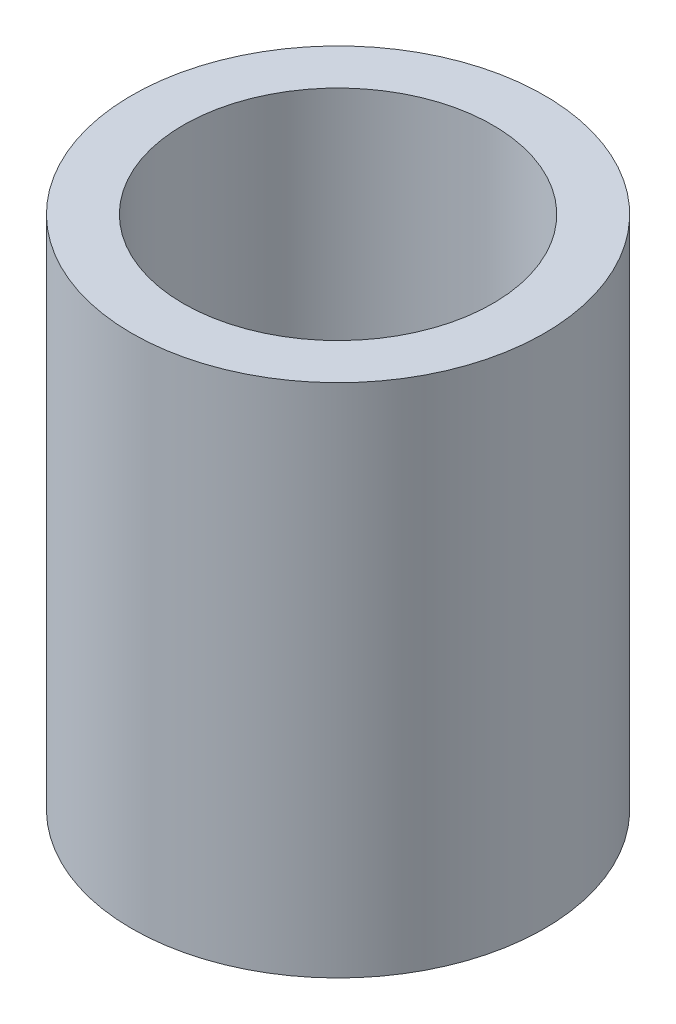
ISO-10303-21;
HEADER;
FILE_DESCRIPTION(('STEP AP214'),'2;1');
FILE_NAME('part.step','',(''),(''),'','','');
FILE_SCHEMA(('AUTOMOTIVE_DESIGN { 1 0 10303 214 1 1 1 1 }'));
ENDSEC;
DATA;
#1=APPLICATION_CONTEXT('core data for automotive mechanical design processes');
#2=APPLICATION_PROTOCOL_DEFINITION('international standard','automotive_design',2000,#1);
#3=PRODUCT_CONTEXT('',#1,'mechanical');
#4=PRODUCT('Part','Part','',(#3));
#5=PRODUCT_RELATED_PRODUCT_CATEGORY('part','',(#4));
#6=PRODUCT_DEFINITION_FORMATION('','',#4);
#7=PRODUCT_DEFINITION_CONTEXT('part definition',#1,'design');
#8=PRODUCT_DEFINITION('design','',#6,#7);
#9=PRODUCT_DEFINITION_SHAPE('','',#8);
#10=(LENGTH_UNIT() NAMED_UNIT(*) SI_UNIT(.MILLI.,.METRE.));
#11=(NAMED_UNIT(*) PLANE_ANGLE_UNIT() SI_UNIT($,.RADIAN.));
#12=(NAMED_UNIT(*) SI_UNIT($,.STERADIAN.) SOLID_ANGLE_UNIT());
#13=UNCERTAINTY_MEASURE_WITH_UNIT(LENGTH_MEASURE(1.E-05),#10,'distance_accuracy_value','');
#14=(GEOMETRIC_REPRESENTATION_CONTEXT(3) GLOBAL_UNCERTAINTY_ASSIGNED_CONTEXT((#13)) GLOBAL_UNIT_ASSIGNED_CONTEXT((#10,
#11,#12)) REPRESENTATION_CONTEXT('',''));
#15=CARTESIAN_POINT('',(0.,0.,0.));
#16=DIRECTION('',(0.,0.,1.));
#17=DIRECTION('',(1.,0.,0.));
#18=AXIS2_PLACEMENT_3D('',#15,#16,#17);
#19=CARTESIAN_POINT('',(0.,20.,0.));
#20=DIRECTION('',(0.,1.,0.));
#21=DIRECTION('',(0.,0.,1.));
#22=AXIS2_PLACEMENT_3D('',#19,#20,#21);
#23=PLANE('',#22);
#24=CARTESIAN_POINT('',(0.,20.,0.));
#25=DIRECTION('',(0.,1.,0.));
#26=DIRECTION('',(0.,0.,1.));
#27=AXIS2_PLACEMENT_3D('',#24,#25,#26);
#28=CIRCLE('',#27,16.);
#29=CARTESIAN_POINT('',(0.,20.,16.));
#30=VERTEX_POINT('',#29);
#31=EDGE_CURVE('E10',#30,#30,#28,.T.);
#32=ORIENTED_EDGE('',*,*,#31,.T.);
#33=EDGE_LOOP('',(#32));
#34=FACE_BOUND('',#33,.T.);
#35=CARTESIAN_POINT('',(0.,20.,0.));
#36=DIRECTION('',(0.,1.,0.));
#37=DIRECTION('',(0.,0.,1.));
#38=AXIS2_PLACEMENT_3D('',#35,#36,#37);
#39=CIRCLE('',#38,12.);
#40=CARTESIAN_POINT('',(0.,20.,12.));
#41=VERTEX_POINT('',#40);
#42=EDGE_CURVE('E41',#41,#41,#39,.T.);
#43=ORIENTED_EDGE('',*,*,#42,.F.);
#44=EDGE_LOOP('',(#43));
#45=FACE_BOUND('',#44,.T.);
#46=ADVANCED_FACE('F30',(#34,#45),#23,.T.);
#47=CARTESIAN_POINT('',(0.,-20.,0.));
#48=DIRECTION('',(0.,1.,0.));
#49=DIRECTION('',(0.,0.,1.));
#50=AXIS2_PLACEMENT_3D('',#47,#48,#49);
#51=PLANE('',#50);
#52=CARTESIAN_POINT('',(0.,-20.,0.));
#53=DIRECTION('',(0.,1.,0.));
#54=DIRECTION('',(0.,0.,1.));
#55=AXIS2_PLACEMENT_3D('',#52,#53,#54);
#56=CIRCLE('',#55,16.);
#57=CARTESIAN_POINT('',(0.,-20.,16.));
#58=VERTEX_POINT('',#57);
#59=EDGE_CURVE('E34',#58,#58,#56,.T.);
#60=ORIENTED_EDGE('',*,*,#59,.F.);
#61=EDGE_LOOP('',(#60));
#62=FACE_BOUND('',#61,.T.);
#63=CARTESIAN_POINT('',(0.,-20.,0.));
#64=DIRECTION('',(0.,1.,0.));
#65=DIRECTION('',(0.,0.,1.));
#66=AXIS2_PLACEMENT_3D('',#63,#64,#65);
#67=CIRCLE('',#66,12.);
#68=CARTESIAN_POINT('',(0.,-20.,12.));
#69=VERTEX_POINT('',#68);
#70=EDGE_CURVE('E43',#69,#69,#67,.T.);
#71=ORIENTED_EDGE('',*,*,#70,.T.);
#72=EDGE_LOOP('',(#71));
#73=FACE_BOUND('',#72,.T.);
#74=ADVANCED_FACE('F53',(#62,#73),#51,.F.);
#75=CARTESIAN_POINT('',(0.,20.,0.));
#76=DIRECTION('',(0.,-1.,0.));
#77=DIRECTION('',(0.,0.,-1.));
#78=AXIS2_PLACEMENT_3D('',#75,#76,#77);
#79=CYLINDRICAL_SURFACE('',#78,16.);
#80=ORIENTED_EDGE('',*,*,#31,.F.);
#81=EDGE_LOOP('',(#80));
#82=FACE_BOUND('',#81,.T.);
#83=ORIENTED_EDGE('',*,*,#59,.T.);
#84=EDGE_LOOP('',(#83));
#85=FACE_BOUND('',#84,.T.);
#86=ADVANCED_FACE('F32',(#82,#85),#79,.T.);
#87=CARTESIAN_POINT('',(0.,20.,0.));
#88=DIRECTION('',(0.,-1.,0.));
#89=DIRECTION('',(0.,0.,-1.));
#90=AXIS2_PLACEMENT_3D('',#87,#88,#89);
#91=CYLINDRICAL_SURFACE('',#90,12.);
#92=ORIENTED_EDGE('',*,*,#42,.T.);
#93=EDGE_LOOP('',(#92));
#94=FACE_BOUND('',#93,.T.);
#95=ORIENTED_EDGE('',*,*,#70,.F.);
#96=EDGE_LOOP('',(#95));
#97=FACE_BOUND('',#96,.T.);
#98=ADVANCED_FACE('F49',(#94,#97),#91,.F.);
#99=CLOSED_SHELL('',(#46,#74,#86,#98));
#100=MANIFOLD_SOLID_BREP('B2',#99);
#101=ADVANCED_BREP_SHAPE_REPRESENTATION('',(#18,#100),#14);
#102=SHAPE_DEFINITION_REPRESENTATION(#9,#101);
ENDSEC;
END-ISO-10303-21;
